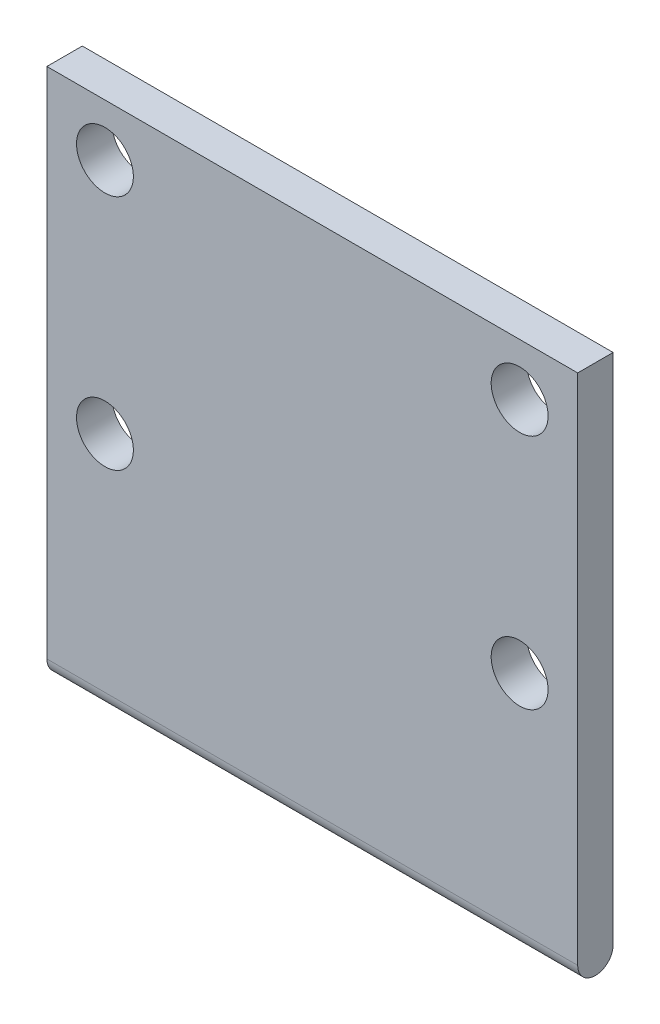
ISO-10303-21;
HEADER;
FILE_DESCRIPTION(('STEP AP214'),'2;1');
FILE_NAME('part.step','',(''),(''),'','','');
FILE_SCHEMA(('AUTOMOTIVE_DESIGN { 1 0 10303 214 1 1 1 1 }'));
ENDSEC;
DATA;
#1=APPLICATION_CONTEXT('core data for automotive mechanical design processes');
#2=APPLICATION_PROTOCOL_DEFINITION('international standard','automotive_design',2000,#1);
#3=PRODUCT_CONTEXT('',#1,'mechanical');
#4=PRODUCT('Part','Part','',(#3));
#5=PRODUCT_RELATED_PRODUCT_CATEGORY('part','',(#4));
#6=PRODUCT_DEFINITION_FORMATION('','',#4);
#7=PRODUCT_DEFINITION_CONTEXT('part definition',#1,'design');
#8=PRODUCT_DEFINITION('design','',#6,#7);
#9=PRODUCT_DEFINITION_SHAPE('','',#8);
#10=(LENGTH_UNIT() NAMED_UNIT(*) SI_UNIT(.MILLI.,.METRE.));
#11=(NAMED_UNIT(*) PLANE_ANGLE_UNIT() SI_UNIT($,.RADIAN.));
#12=(NAMED_UNIT(*) SI_UNIT($,.STERADIAN.) SOLID_ANGLE_UNIT());
#13=UNCERTAINTY_MEASURE_WITH_UNIT(LENGTH_MEASURE(1.E-05),#10,'distance_accuracy_value','');
#14=(GEOMETRIC_REPRESENTATION_CONTEXT(3) GLOBAL_UNCERTAINTY_ASSIGNED_CONTEXT((#13)) GLOBAL_UNIT_ASSIGNED_CONTEXT((#10,
#11,#12)) REPRESENTATION_CONTEXT('',''));
#15=CARTESIAN_POINT('',(0.,0.,0.));
#16=DIRECTION('',(0.,0.,1.));
#17=DIRECTION('',(1.,0.,0.));
#18=AXIS2_PLACEMENT_3D('',#15,#16,#17);
#19=CARTESIAN_POINT('',(-22.4,1.495,0.));
#20=DIRECTION('',(1.,0.,0.));
#21=DIRECTION('',(0.,0.,-1.));
#22=AXIS2_PLACEMENT_3D('',#19,#20,#21);
#23=CYLINDRICAL_SURFACE('',#22,1.495);
#24=DIRECTION('',(-1.,0.,0.));
#25=VECTOR('',#24,1.);
#26=CARTESIAN_POINT('',(-22.4,1.495,1.495));
#27=LINE('',#26,#25);
#28=CARTESIAN_POINT('',(-22.4,1.495,1.495));
#29=VERTEX_POINT('',#28);
#30=CARTESIAN_POINT('',(22.4,1.495,1.495));
#31=VERTEX_POINT('',#30);
#32=EDGE_CURVE('E101',#29,#31,#27,.F.);
#33=ORIENTED_EDGE('',*,*,#32,.F.);
#34=CARTESIAN_POINT('',(-22.4,1.495,0.));
#35=DIRECTION('',(1.,0.,0.));
#36=DIRECTION('',(0.,0.,-1.));
#37=AXIS2_PLACEMENT_3D('',#34,#35,#36);
#38=CIRCLE('',#37,1.495);
#39=CARTESIAN_POINT('',(-22.4,1.495,-1.495));
#40=VERTEX_POINT('',#39);
#41=EDGE_CURVE('E51',#40,#29,#38,.F.);
#42=ORIENTED_EDGE('',*,*,#41,.F.);
#43=DIRECTION('',(-1.,0.,0.));
#44=VECTOR('',#43,1.);
#45=CARTESIAN_POINT('',(-22.4,1.495,-1.495));
#46=LINE('',#45,#44);
#47=CARTESIAN_POINT('',(22.4,1.495,-1.495));
#48=VERTEX_POINT('',#47);
#49=EDGE_CURVE('E104',#48,#40,#46,.T.);
#50=ORIENTED_EDGE('',*,*,#49,.F.);
#51=CARTESIAN_POINT('',(22.4,1.495,0.));
#52=DIRECTION('',(-1.,0.,0.));
#53=DIRECTION('',(0.,0.,1.));
#54=AXIS2_PLACEMENT_3D('',#51,#52,#53);
#55=CIRCLE('',#54,1.495);
#56=EDGE_CURVE('E11',#31,#48,#55,.F.);
#57=ORIENTED_EDGE('',*,*,#56,.F.);
#58=EDGE_LOOP('',(#33,#42,#50,#57));
#59=FACE_BOUND('',#58,.T.);
#60=ADVANCED_FACE('F43',(#59),#23,.T.);
#61=CARTESIAN_POINT('',(22.4,44.8,1.495));
#62=DIRECTION('',(-1.,0.,0.));
#63=DIRECTION('',(0.,0.,1.));
#64=AXIS2_PLACEMENT_3D('',#61,#62,#63);
#65=PLANE('',#64);
#66=DIRECTION('',(0.,-1.,0.));
#67=VECTOR('',#66,1.);
#68=CARTESIAN_POINT('',(22.4,44.8,1.495));
#69=LINE('',#68,#67);
#70=CARTESIAN_POINT('',(22.4,44.8,1.495));
#71=VERTEX_POINT('',#70);
#72=EDGE_CURVE('E116',#71,#31,#69,.T.);
#73=ORIENTED_EDGE('',*,*,#72,.T.);
#74=ORIENTED_EDGE('',*,*,#56,.T.);
#75=DIRECTION('',(0.,-1.,0.));
#76=VECTOR('',#75,1.);
#77=CARTESIAN_POINT('',(22.4,44.8,-1.495));
#78=LINE('',#77,#76);
#79=CARTESIAN_POINT('',(22.4,44.8,-1.495));
#80=VERTEX_POINT('',#79);
#81=EDGE_CURVE('E85',#80,#48,#78,.T.);
#82=ORIENTED_EDGE('',*,*,#81,.F.);
#83=DIRECTION('',(0.,0.,-1.));
#84=VECTOR('',#83,1.);
#85=CARTESIAN_POINT('',(22.4,44.8,1.495));
#86=LINE('',#85,#84);
#87=EDGE_CURVE('E91',#71,#80,#86,.T.);
#88=ORIENTED_EDGE('',*,*,#87,.F.);
#89=EDGE_LOOP('',(#73,#74,#82,#88));
#90=FACE_BOUND('',#89,.T.);
#91=ADVANCED_FACE('F100',(#90),#65,.F.);
#92=CARTESIAN_POINT('',(-22.4,44.8,-1.495));
#93=DIRECTION('',(0.,0.,1.));
#94=DIRECTION('',(1.,0.,0.));
#95=AXIS2_PLACEMENT_3D('',#92,#93,#94);
#96=PLANE('',#95);
#97=CARTESIAN_POINT('',(-7.5,8.2,-1.495));
#98=DIRECTION('',(0.,0.,1.));
#99=DIRECTION('',(1.,0.,0.));
#100=AXIS2_PLACEMENT_3D('',#97,#98,#99);
#101=CIRCLE('',#100,1.4818525370309);
#102=CARTESIAN_POINT('',(-6.0181474629691,8.2,-1.495));
#103=VERTEX_POINT('',#102);
#104=EDGE_CURVE('E144',#103,#103,#101,.T.);
#105=ORIENTED_EDGE('',*,*,#104,.T.);
#106=EDGE_LOOP('',(#105));
#107=FACE_BOUND('',#106,.T.);
#108=CARTESIAN_POINT('',(7.5,8.2,-1.495));
#109=DIRECTION('',(0.,0.,1.));
#110=DIRECTION('',(1.,0.,0.));
#111=AXIS2_PLACEMENT_3D('',#108,#109,#110);
#112=CIRCLE('',#111,1.24964282442419);
#113=CARTESIAN_POINT('',(8.74964282442419,8.2,-1.495));
#114=VERTEX_POINT('',#113);
#115=EDGE_CURVE('E147',#114,#114,#112,.T.);
#116=ORIENTED_EDGE('',*,*,#115,.T.);
#117=EDGE_LOOP('',(#116));
#118=FACE_BOUND('',#117,.T.);
#119=CARTESIAN_POINT('',(-17.5,40.4,-1.495));
#120=DIRECTION('',(0.,0.,1.));
#121=DIRECTION('',(1.,0.,0.));
#122=AXIS2_PLACEMENT_3D('',#119,#120,#121);
#123=CIRCLE('',#122,2.39999999999999);
#124=CARTESIAN_POINT('',(-15.1,40.4,-1.495));
#125=VERTEX_POINT('',#124);
#126=EDGE_CURVE('E138',#125,#125,#123,.T.);
#127=ORIENTED_EDGE('',*,*,#126,.T.);
#128=EDGE_LOOP('',(#127));
#129=FACE_BOUND('',#128,.T.);
#130=CARTESIAN_POINT('',(-17.5,20.4,-1.495));
#131=DIRECTION('',(0.,0.,1.));
#132=DIRECTION('',(1.,0.,0.));
#133=AXIS2_PLACEMENT_3D('',#130,#131,#132);
#134=CIRCLE('',#133,2.39999999999999);
#135=CARTESIAN_POINT('',(-15.1,20.4,-1.495));
#136=VERTEX_POINT('',#135);
#137=EDGE_CURVE('E132',#136,#136,#134,.T.);
#138=ORIENTED_EDGE('',*,*,#137,.T.);
#139=EDGE_LOOP('',(#138));
#140=FACE_BOUND('',#139,.T.);
#141=CARTESIAN_POINT('',(17.5,20.4,-1.495));
#142=DIRECTION('',(0.,0.,1.));
#143=DIRECTION('',(1.,0.,0.));
#144=AXIS2_PLACEMENT_3D('',#141,#142,#143);
#145=CIRCLE('',#144,2.39999999999999);
#146=CARTESIAN_POINT('',(19.9,20.4,-1.495));
#147=VERTEX_POINT('',#146);
#148=EDGE_CURVE('E126',#147,#147,#145,.T.);
#149=ORIENTED_EDGE('',*,*,#148,.T.);
#150=EDGE_LOOP('',(#149));
#151=FACE_BOUND('',#150,.T.);
#152=CARTESIAN_POINT('',(17.5,40.4,-1.495));
#153=DIRECTION('',(0.,0.,1.));
#154=DIRECTION('',(1.,0.,0.));
#155=AXIS2_PLACEMENT_3D('',#152,#153,#154);
#156=CIRCLE('',#155,2.39999999999999);
#157=CARTESIAN_POINT('',(19.9,40.4,-1.495));
#158=VERTEX_POINT('',#157);
#159=EDGE_CURVE('E98',#158,#158,#156,.T.);
#160=ORIENTED_EDGE('',*,*,#159,.T.);
#161=EDGE_LOOP('',(#160));
#162=FACE_BOUND('',#161,.T.);
#163=ORIENTED_EDGE('',*,*,#81,.T.);
#164=ORIENTED_EDGE('',*,*,#49,.T.);
#165=DIRECTION('',(0.,-1.,0.));
#166=VECTOR('',#165,1.);
#167=CARTESIAN_POINT('',(-22.4,44.8,-1.495));
#168=LINE('',#167,#166);
#169=CARTESIAN_POINT('',(-22.4,44.8,-1.495));
#170=VERTEX_POINT('',#169);
#171=EDGE_CURVE('E87',#170,#40,#168,.T.);
#172=ORIENTED_EDGE('',*,*,#171,.F.);
#173=DIRECTION('',(-1.,0.,0.));
#174=VECTOR('',#173,1.);
#175=CARTESIAN_POINT('',(-22.4,44.8,-1.495));
#176=LINE('',#175,#174);
#177=EDGE_CURVE('E82',#80,#170,#176,.T.);
#178=ORIENTED_EDGE('',*,*,#177,.F.);
#179=EDGE_LOOP('',(#163,#164,#172,#178));
#180=FACE_BOUND('',#179,.T.);
#181=ADVANCED_FACE('F84',(#107,#118,#129,#140,#151,#162,#180),#96,.F.);
#182=CARTESIAN_POINT('',(-22.4,44.8,1.495));
#183=DIRECTION('',(1.,0.,0.));
#184=DIRECTION('',(0.,0.,-1.));
#185=AXIS2_PLACEMENT_3D('',#182,#183,#184);
#186=PLANE('',#185);
#187=ORIENTED_EDGE('',*,*,#171,.T.);
#188=ORIENTED_EDGE('',*,*,#41,.T.);
#189=DIRECTION('',(0.,-1.,0.));
#190=VECTOR('',#189,1.);
#191=CARTESIAN_POINT('',(-22.4,44.8,1.495));
#192=LINE('',#191,#190);
#193=CARTESIAN_POINT('',(-22.4,44.8,1.495));
#194=VERTEX_POINT('',#193);
#195=EDGE_CURVE('E106',#194,#29,#192,.T.);
#196=ORIENTED_EDGE('',*,*,#195,.F.);
#197=DIRECTION('',(0.,0.,1.));
#198=VECTOR('',#197,1.);
#199=CARTESIAN_POINT('',(-22.4,44.8,1.495));
#200=LINE('',#199,#198);
#201=EDGE_CURVE('E90',#170,#194,#200,.T.);
#202=ORIENTED_EDGE('',*,*,#201,.F.);
#203=EDGE_LOOP('',(#187,#188,#196,#202));
#204=FACE_BOUND('',#203,.T.);
#205=ADVANCED_FACE('F112',(#204),#186,.F.);
#206=CARTESIAN_POINT('',(-22.4,44.8,1.495));
#207=DIRECTION('',(0.,0.,-1.));
#208=DIRECTION('',(-1.,0.,0.));
#209=AXIS2_PLACEMENT_3D('',#206,#207,#208);
#210=PLANE('',#209);
#211=CARTESIAN_POINT('',(-17.5,40.4,1.495));
#212=DIRECTION('',(0.,0.,1.));
#213=DIRECTION('',(1.,0.,0.));
#214=AXIS2_PLACEMENT_3D('',#211,#212,#213);
#215=CIRCLE('',#214,2.39999999999999);
#216=CARTESIAN_POINT('',(-15.1,40.4,1.495));
#217=VERTEX_POINT('',#216);
#218=EDGE_CURVE('E141',#217,#217,#215,.T.);
#219=ORIENTED_EDGE('',*,*,#218,.F.);
#220=EDGE_LOOP('',(#219));
#221=FACE_BOUND('',#220,.T.);
#222=CARTESIAN_POINT('',(-17.5,20.4,1.495));
#223=DIRECTION('',(0.,0.,1.));
#224=DIRECTION('',(1.,0.,0.));
#225=AXIS2_PLACEMENT_3D('',#222,#223,#224);
#226=CIRCLE('',#225,2.39999999999999);
#227=CARTESIAN_POINT('',(-15.1,20.4,1.495));
#228=VERTEX_POINT('',#227);
#229=EDGE_CURVE('E135',#228,#228,#226,.T.);
#230=ORIENTED_EDGE('',*,*,#229,.F.);
#231=EDGE_LOOP('',(#230));
#232=FACE_BOUND('',#231,.T.);
#233=CARTESIAN_POINT('',(17.5,20.4,1.495));
#234=DIRECTION('',(0.,0.,1.));
#235=DIRECTION('',(1.,0.,0.));
#236=AXIS2_PLACEMENT_3D('',#233,#234,#235);
#237=CIRCLE('',#236,2.39999999999999);
#238=CARTESIAN_POINT('',(19.9,20.4,1.495));
#239=VERTEX_POINT('',#238);
#240=EDGE_CURVE('E129',#239,#239,#237,.T.);
#241=ORIENTED_EDGE('',*,*,#240,.F.);
#242=EDGE_LOOP('',(#241));
#243=FACE_BOUND('',#242,.T.);
#244=CARTESIAN_POINT('',(17.5,40.4,1.495));
#245=DIRECTION('',(0.,0.,1.));
#246=DIRECTION('',(1.,0.,0.));
#247=AXIS2_PLACEMENT_3D('',#244,#245,#246);
#248=CIRCLE('',#247,2.39999999999999);
#249=CARTESIAN_POINT('',(19.9,40.4,1.495));
#250=VERTEX_POINT('',#249);
#251=EDGE_CURVE('E123',#250,#250,#248,.T.);
#252=ORIENTED_EDGE('',*,*,#251,.F.);
#253=EDGE_LOOP('',(#252));
#254=FACE_BOUND('',#253,.T.);
#255=ORIENTED_EDGE('',*,*,#195,.T.);
#256=ORIENTED_EDGE('',*,*,#32,.T.);
#257=ORIENTED_EDGE('',*,*,#72,.F.);
#258=DIRECTION('',(1.,0.,0.));
#259=VECTOR('',#258,1.);
#260=CARTESIAN_POINT('',(-22.4,44.8,1.495));
#261=LINE('',#260,#259);
#262=EDGE_CURVE('E96',#194,#71,#261,.T.);
#263=ORIENTED_EDGE('',*,*,#262,.F.);
#264=EDGE_LOOP('',(#255,#256,#257,#263));
#265=FACE_BOUND('',#264,.T.);
#266=ADVANCED_FACE('F115',(#221,#232,#243,#254,#265),#210,.F.);
#267=CARTESIAN_POINT('',(0.,44.8,0.));
#268=DIRECTION('',(0.,-1.,0.));
#269=DIRECTION('',(0.,0.,-1.));
#270=AXIS2_PLACEMENT_3D('',#267,#268,#269);
#271=PLANE('',#270);
#272=ORIENTED_EDGE('',*,*,#87,.T.);
#273=ORIENTED_EDGE('',*,*,#177,.T.);
#274=ORIENTED_EDGE('',*,*,#201,.T.);
#275=ORIENTED_EDGE('',*,*,#262,.T.);
#276=EDGE_LOOP('',(#272,#273,#274,#275));
#277=FACE_BOUND('',#276,.T.);
#278=ADVANCED_FACE('F94',(#277),#271,.F.);
#279=CARTESIAN_POINT('',(17.5,40.4,1.495));
#280=DIRECTION('',(0.,0.,1.));
#281=DIRECTION('',(1.,0.,0.));
#282=AXIS2_PLACEMENT_3D('',#279,#280,#281);
#283=CYLINDRICAL_SURFACE('',#282,2.39999999999999);
#284=ORIENTED_EDGE('',*,*,#159,.F.);
#285=EDGE_LOOP('',(#284));
#286=FACE_BOUND('',#285,.T.);
#287=ORIENTED_EDGE('',*,*,#251,.T.);
#288=EDGE_LOOP('',(#287));
#289=FACE_BOUND('',#288,.T.);
#290=ADVANCED_FACE('F187',(#286,#289),#283,.F.);
#291=CARTESIAN_POINT('',(17.5,20.4,1.495));
#292=DIRECTION('',(0.,0.,1.));
#293=DIRECTION('',(1.,0.,0.));
#294=AXIS2_PLACEMENT_3D('',#291,#292,#293);
#295=CYLINDRICAL_SURFACE('',#294,2.39999999999999);
#296=ORIENTED_EDGE('',*,*,#148,.F.);
#297=EDGE_LOOP('',(#296));
#298=FACE_BOUND('',#297,.T.);
#299=ORIENTED_EDGE('',*,*,#240,.T.);
#300=EDGE_LOOP('',(#299));
#301=FACE_BOUND('',#300,.T.);
#302=ADVANCED_FACE('F190',(#298,#301),#295,.F.);
#303=CARTESIAN_POINT('',(-17.5,20.4,1.495));
#304=DIRECTION('',(0.,0.,1.));
#305=DIRECTION('',(1.,0.,0.));
#306=AXIS2_PLACEMENT_3D('',#303,#304,#305);
#307=CYLINDRICAL_SURFACE('',#306,2.39999999999999);
#308=ORIENTED_EDGE('',*,*,#137,.F.);
#309=EDGE_LOOP('',(#308));
#310=FACE_BOUND('',#309,.T.);
#311=ORIENTED_EDGE('',*,*,#229,.T.);
#312=EDGE_LOOP('',(#311));
#313=FACE_BOUND('',#312,.T.);
#314=ADVANCED_FACE('F194',(#310,#313),#307,.F.);
#315=CARTESIAN_POINT('',(-17.5,40.4,1.495));
#316=DIRECTION('',(0.,0.,1.));
#317=DIRECTION('',(1.,0.,0.));
#318=AXIS2_PLACEMENT_3D('',#315,#316,#317);
#319=CYLINDRICAL_SURFACE('',#318,2.39999999999999);
#320=ORIENTED_EDGE('',*,*,#126,.F.);
#321=EDGE_LOOP('',(#320));
#322=FACE_BOUND('',#321,.T.);
#323=ORIENTED_EDGE('',*,*,#218,.T.);
#324=EDGE_LOOP('',(#323));
#325=FACE_BOUND('',#324,.T.);
#326=ADVANCED_FACE('F198',(#322,#325),#319,.F.);
#327=CARTESIAN_POINT('',(7.5,8.2,-5.495));
#328=DIRECTION('',(0.,0.,1.));
#329=DIRECTION('',(1.,0.,0.));
#330=AXIS2_PLACEMENT_3D('',#327,#328,#329);
#331=CYLINDRICAL_SURFACE('',#330,1.24964282442419);
#332=CARTESIAN_POINT('',(7.5,8.2,-5.495));
#333=DIRECTION('',(0.,0.,1.));
#334=DIRECTION('',(1.,0.,0.));
#335=AXIS2_PLACEMENT_3D('',#332,#333,#334);
#336=CIRCLE('',#335,1.24964282442419);
#337=CARTESIAN_POINT('',(8.74964282442419,8.2,-5.49499999999999));
#338=VERTEX_POINT('',#337);
#339=EDGE_CURVE('E153',#338,#338,#336,.T.);
#340=ORIENTED_EDGE('',*,*,#339,.T.);
#341=EDGE_LOOP('',(#340));
#342=FACE_BOUND('',#341,.T.);
#343=ORIENTED_EDGE('',*,*,#115,.F.);
#344=EDGE_LOOP('',(#343));
#345=FACE_BOUND('',#344,.T.);
#346=ADVANCED_FACE('F157',(#342,#345),#331,.T.);
#347=CARTESIAN_POINT('',(-7.5,8.2,-5.495));
#348=DIRECTION('',(0.,0.,1.));
#349=DIRECTION('',(1.,0.,0.));
#350=AXIS2_PLACEMENT_3D('',#347,#348,#349);
#351=CYLINDRICAL_SURFACE('',#350,1.4818525370309);
#352=CARTESIAN_POINT('',(-7.5,8.2,-5.495));
#353=DIRECTION('',(0.,0.,1.));
#354=DIRECTION('',(1.,0.,0.));
#355=AXIS2_PLACEMENT_3D('',#352,#353,#354);
#356=CIRCLE('',#355,1.4818525370309);
#357=CARTESIAN_POINT('',(-6.0181474629691,8.2,-5.49499999999999));
#358=VERTEX_POINT('',#357);
#359=EDGE_CURVE('E150',#358,#358,#356,.T.);
#360=ORIENTED_EDGE('',*,*,#359,.T.);
#361=EDGE_LOOP('',(#360));
#362=FACE_BOUND('',#361,.T.);
#363=ORIENTED_EDGE('',*,*,#104,.F.);
#364=EDGE_LOOP('',(#363));
#365=FACE_BOUND('',#364,.T.);
#366=ADVANCED_FACE('F167',(#362,#365),#351,.T.);
#367=CARTESIAN_POINT('',(-7.5,8.2,-5.495));
#368=DIRECTION('',(0.,1.,0.));
#369=DIRECTION('',(1.,0.,0.));
#370=AXIS2_PLACEMENT_3D('',#367,#368,#369);
#371=SPHERICAL_SURFACE('',#370,1.4818525370309);
#372=CARTESIAN_POINT('',(-7.5,8.2,-5.495));
#373=DIRECTION('',(0.,0.,1.));
#374=DIRECTION('',(1.,0.,0.));
#375=AXIS2_PLACEMENT_3D('',#372,#373,#374);
#376=SPHERICAL_SURFACE('',#375,1.4818525370309);
#377=ORIENTED_EDGE('',*,*,#359,.F.);
#378=EDGE_LOOP('',(#377));
#379=FACE_BOUND('',#378,.T.);
#380=ADVANCED_FACE('F162',(#379),#376,.T.);
#381=CARTESIAN_POINT('',(7.5,8.2,-5.495));
#382=DIRECTION('',(0.,1.,0.));
#383=DIRECTION('',(1.,0.,0.));
#384=AXIS2_PLACEMENT_3D('',#381,#382,#383);
#385=SPHERICAL_SURFACE('',#384,1.24964282442419);
#386=CARTESIAN_POINT('',(7.5,8.2,-5.495));
#387=DIRECTION('',(0.,0.,1.));
#388=DIRECTION('',(1.,0.,0.));
#389=AXIS2_PLACEMENT_3D('',#386,#387,#388);
#390=SPHERICAL_SURFACE('',#389,1.24964282442419);
#391=ORIENTED_EDGE('',*,*,#339,.F.);
#392=EDGE_LOOP('',(#391));
#393=FACE_BOUND('',#392,.T.);
#394=ADVANCED_FACE('F160',(#393),#390,.T.);
#395=CLOSED_SHELL('',(#60,#91,#181,#205,#266,#278,#290,#302,#314,#326,#346,#366,#380,#394));
#396=MANIFOLD_SOLID_BREP('B2',#395);
#397=ADVANCED_BREP_SHAPE_REPRESENTATION('',(#18,#396),#14);
#398=SHAPE_DEFINITION_REPRESENTATION(#9,#397);
ENDSEC;
END-ISO-10303-21;
